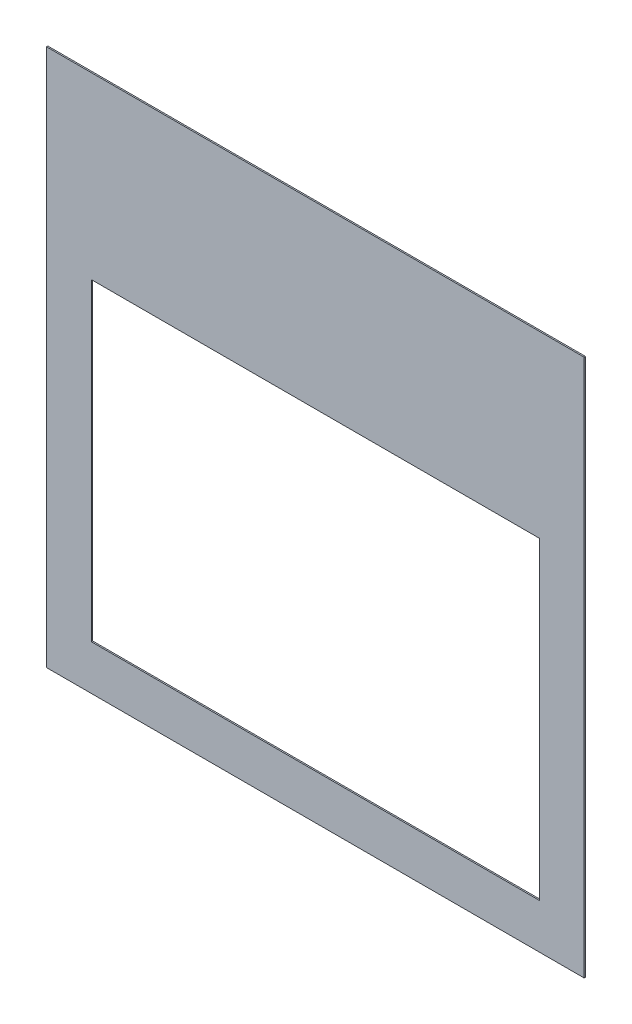
ISO-10303-21;
HEADER;
FILE_DESCRIPTION(('STEP AP214'),'2;1');
FILE_NAME('part.step','',(''),(''),'','','');
FILE_SCHEMA(('AUTOMOTIVE_DESIGN { 1 0 10303 214 1 1 1 1 }'));
ENDSEC;
DATA;
#1=APPLICATION_CONTEXT('core data for automotive mechanical design processes');
#2=APPLICATION_PROTOCOL_DEFINITION('international standard','automotive_design',2000,#1);
#3=PRODUCT_CONTEXT('',#1,'mechanical');
#4=PRODUCT('Part','Part','',(#3));
#5=PRODUCT_RELATED_PRODUCT_CATEGORY('part','',(#4));
#6=PRODUCT_DEFINITION_FORMATION('','',#4);
#7=PRODUCT_DEFINITION_CONTEXT('part definition',#1,'design');
#8=PRODUCT_DEFINITION('design','',#6,#7);
#9=PRODUCT_DEFINITION_SHAPE('','',#8);
#10=(LENGTH_UNIT() NAMED_UNIT(*) SI_UNIT(.MILLI.,.METRE.));
#11=(NAMED_UNIT(*) PLANE_ANGLE_UNIT() SI_UNIT($,.RADIAN.));
#12=(NAMED_UNIT(*) SI_UNIT($,.STERADIAN.) SOLID_ANGLE_UNIT());
#13=UNCERTAINTY_MEASURE_WITH_UNIT(LENGTH_MEASURE(1.E-05),#10,'distance_accuracy_value','');
#14=(GEOMETRIC_REPRESENTATION_CONTEXT(3) GLOBAL_UNCERTAINTY_ASSIGNED_CONTEXT((#13)) GLOBAL_UNIT_ASSIGNED_CONTEXT((#10,
#11,#12)) REPRESENTATION_CONTEXT('',''));
#15=CARTESIAN_POINT('',(0.,0.,0.));
#16=DIRECTION('',(0.,0.,1.));
#17=DIRECTION('',(1.,0.,0.));
#18=AXIS2_PLACEMENT_3D('',#15,#16,#17);
#19=CARTESIAN_POINT('',(-600.,0.,-3.));
#20=DIRECTION('',(-1.,0.,0.));
#21=DIRECTION('',(0.,-1.,0.));
#22=AXIS2_PLACEMENT_3D('',#19,#20,#21);
#23=PLANE('',#22);
#24=DIRECTION('',(0.,-1.,0.));
#25=VECTOR('',#24,1.);
#26=CARTESIAN_POINT('',(-600.,0.,0.));
#27=LINE('',#26,#25);
#28=CARTESIAN_POINT('',(-600.,0.,0.));
#29=VERTEX_POINT('',#28);
#30=CARTESIAN_POINT('',(-600.,-1200.,0.));
#31=VERTEX_POINT('',#30);
#32=EDGE_CURVE('E139',#29,#31,#27,.T.);
#33=ORIENTED_EDGE('',*,*,#32,.F.);
#34=DIRECTION('',(0.,0.,1.));
#35=VECTOR('',#34,1.);
#36=CARTESIAN_POINT('',(-600.,0.,-3.));
#37=LINE('',#36,#35);
#38=CARTESIAN_POINT('',(-600.,0.,-3.));
#39=VERTEX_POINT('',#38);
#40=EDGE_CURVE('E11',#39,#29,#37,.T.);
#41=ORIENTED_EDGE('',*,*,#40,.F.);
#42=DIRECTION('',(0.,-1.,0.));
#43=VECTOR('',#42,1.);
#44=CARTESIAN_POINT('',(-600.,0.,-3.));
#45=LINE('',#44,#43);
#46=CARTESIAN_POINT('',(-600.,-1200.,-3.));
#47=VERTEX_POINT('',#46);
#48=EDGE_CURVE('E143',#39,#47,#45,.T.);
#49=ORIENTED_EDGE('',*,*,#48,.T.);
#50=DIRECTION('',(0.,0.,1.));
#51=VECTOR('',#50,1.);
#52=CARTESIAN_POINT('',(-600.,-1200.,-3.));
#53=LINE('',#52,#51);
#54=EDGE_CURVE('E44',#47,#31,#53,.T.);
#55=ORIENTED_EDGE('',*,*,#54,.T.);
#56=EDGE_LOOP('',(#33,#41,#49,#55));
#57=FACE_BOUND('',#56,.T.);
#58=ADVANCED_FACE('F41',(#57),#23,.T.);
#59=CARTESIAN_POINT('',(-600.,0.,-3.));
#60=DIRECTION('',(0.,1.,0.));
#61=DIRECTION('',(-1.,0.,0.));
#62=AXIS2_PLACEMENT_3D('',#59,#60,#61);
#63=PLANE('',#62);
#64=DIRECTION('',(-1.,0.,0.));
#65=VECTOR('',#64,1.);
#66=CARTESIAN_POINT('',(-600.,0.,0.));
#67=LINE('',#66,#65);
#68=CARTESIAN_POINT('',(600.,2.20436423846524E-13,0.));
#69=VERTEX_POINT('',#68);
#70=EDGE_CURVE('E147',#69,#29,#67,.T.);
#71=ORIENTED_EDGE('',*,*,#70,.F.);
#72=DIRECTION('',(0.,0.,1.));
#73=VECTOR('',#72,1.);
#74=CARTESIAN_POINT('',(600.,2.20436423846524E-13,-3.));
#75=LINE('',#74,#73);
#76=CARTESIAN_POINT('',(600.,2.20436423846524E-13,-3.));
#77=VERTEX_POINT('',#76);
#78=EDGE_CURVE('E49',#77,#69,#75,.T.);
#79=ORIENTED_EDGE('',*,*,#78,.F.);
#80=DIRECTION('',(-1.,0.,0.));
#81=VECTOR('',#80,1.);
#82=CARTESIAN_POINT('',(-600.,0.,-3.));
#83=LINE('',#82,#81);
#84=EDGE_CURVE('E153',#77,#39,#83,.T.);
#85=ORIENTED_EDGE('',*,*,#84,.T.);
#86=ORIENTED_EDGE('',*,*,#40,.T.);
#87=EDGE_LOOP('',(#71,#79,#85,#86));
#88=FACE_BOUND('',#87,.T.);
#89=ADVANCED_FACE('F179',(#88),#63,.T.);
#90=CARTESIAN_POINT('',(600.,2.20436423846524E-13,-3.));
#91=DIRECTION('',(1.,0.,0.));
#92=DIRECTION('',(0.,1.,0.));
#93=AXIS2_PLACEMENT_3D('',#90,#91,#92);
#94=PLANE('',#93);
#95=DIRECTION('',(0.,1.,0.));
#96=VECTOR('',#95,1.);
#97=CARTESIAN_POINT('',(600.,2.20436423846524E-13,0.));
#98=LINE('',#97,#96);
#99=CARTESIAN_POINT('',(600.,-1200.,0.));
#100=VERTEX_POINT('',#99);
#101=EDGE_CURVE('E161',#100,#69,#98,.T.);
#102=ORIENTED_EDGE('',*,*,#101,.F.);
#103=DIRECTION('',(0.,0.,1.));
#104=VECTOR('',#103,1.);
#105=CARTESIAN_POINT('',(600.,-1200.,-3.));
#106=LINE('',#105,#104);
#107=CARTESIAN_POINT('',(600.,-1200.,-3.));
#108=VERTEX_POINT('',#107);
#109=EDGE_CURVE('E166',#108,#100,#106,.T.);
#110=ORIENTED_EDGE('',*,*,#109,.F.);
#111=DIRECTION('',(0.,1.,0.));
#112=VECTOR('',#111,1.);
#113=CARTESIAN_POINT('',(600.,2.20436423846524E-13,-3.));
#114=LINE('',#113,#112);
#115=EDGE_CURVE('E150',#108,#77,#114,.T.);
#116=ORIENTED_EDGE('',*,*,#115,.T.);
#117=ORIENTED_EDGE('',*,*,#78,.T.);
#118=EDGE_LOOP('',(#102,#110,#116,#117));
#119=FACE_BOUND('',#118,.T.);
#120=ADVANCED_FACE('F183',(#119),#94,.T.);
#121=CARTESIAN_POINT('',(-600.,-1200.,-3.));
#122=DIRECTION('',(0.,-1.,0.));
#123=DIRECTION('',(1.,0.,0.));
#124=AXIS2_PLACEMENT_3D('',#121,#122,#123);
#125=PLANE('',#124);
#126=DIRECTION('',(1.,0.,0.));
#127=VECTOR('',#126,1.);
#128=CARTESIAN_POINT('',(-600.,-1200.,0.));
#129=LINE('',#128,#127);
#130=EDGE_CURVE('E158',#31,#100,#129,.T.);
#131=ORIENTED_EDGE('',*,*,#130,.F.);
#132=ORIENTED_EDGE('',*,*,#54,.F.);
#133=DIRECTION('',(1.,0.,0.));
#134=VECTOR('',#133,1.);
#135=CARTESIAN_POINT('',(-600.,-1200.,-3.));
#136=LINE('',#135,#134);
#137=EDGE_CURVE('E146',#47,#108,#136,.T.);
#138=ORIENTED_EDGE('',*,*,#137,.T.);
#139=ORIENTED_EDGE('',*,*,#109,.T.);
#140=EDGE_LOOP('',(#131,#132,#138,#139));
#141=FACE_BOUND('',#140,.T.);
#142=ADVANCED_FACE('F174',(#141),#125,.T.);
#143=CARTESIAN_POINT('',(0.,0.,-3.));
#144=DIRECTION('',(0.,0.,1.));
#145=DIRECTION('',(1.,0.,0.));
#146=AXIS2_PLACEMENT_3D('',#143,#144,#145);
#147=PLANE('',#146);
#148=DIRECTION('',(-1.,0.,0.));
#149=VECTOR('',#148,1.);
#150=CARTESIAN_POINT('',(-500.,-400.,-3.));
#151=LINE('',#150,#149);
#152=CARTESIAN_POINT('',(500.,-400.,-3.));
#153=VERTEX_POINT('',#152);
#154=CARTESIAN_POINT('',(-500.,-400.,-3.));
#155=VERTEX_POINT('',#154);
#156=EDGE_CURVE('E114',#153,#155,#151,.T.);
#157=ORIENTED_EDGE('',*,*,#156,.T.);
#158=DIRECTION('',(0.,-1.,0.));
#159=VECTOR('',#158,1.);
#160=CARTESIAN_POINT('',(-500.,-400.,-3.));
#161=LINE('',#160,#159);
#162=CARTESIAN_POINT('',(-500.,-1100.,-3.));
#163=VERTEX_POINT('',#162);
#164=EDGE_CURVE('E108',#155,#163,#161,.T.);
#165=ORIENTED_EDGE('',*,*,#164,.T.);
#166=DIRECTION('',(1.,0.,0.));
#167=VECTOR('',#166,1.);
#168=CARTESIAN_POINT('',(-500.,-1100.,-3.));
#169=LINE('',#168,#167);
#170=CARTESIAN_POINT('',(500.,-1100.,-3.));
#171=VERTEX_POINT('',#170);
#172=EDGE_CURVE('E117',#163,#171,#169,.T.);
#173=ORIENTED_EDGE('',*,*,#172,.T.);
#174=DIRECTION('',(0.,1.,0.));
#175=VECTOR('',#174,1.);
#176=CARTESIAN_POINT('',(500.,-400.,-3.));
#177=LINE('',#176,#175);
#178=EDGE_CURVE('E57',#171,#153,#177,.T.);
#179=ORIENTED_EDGE('',*,*,#178,.T.);
#180=EDGE_LOOP('',(#157,#165,#173,#179));
#181=FACE_BOUND('',#180,.T.);
#182=ORIENTED_EDGE('',*,*,#48,.F.);
#183=ORIENTED_EDGE('',*,*,#84,.F.);
#184=ORIENTED_EDGE('',*,*,#115,.F.);
#185=ORIENTED_EDGE('',*,*,#137,.F.);
#186=EDGE_LOOP('',(#182,#183,#184,#185));
#187=FACE_BOUND('',#186,.T.);
#188=ADVANCED_FACE('F121',(#181,#187),#147,.F.);
#189=CARTESIAN_POINT('',(0.,0.,0.));
#190=DIRECTION('',(0.,0.,1.));
#191=DIRECTION('',(1.,0.,0.));
#192=AXIS2_PLACEMENT_3D('',#189,#190,#191);
#193=PLANE('',#192);
#194=DIRECTION('',(0.,-1.,0.));
#195=VECTOR('',#194,1.);
#196=CARTESIAN_POINT('',(-500.,-400.,0.));
#197=LINE('',#196,#195);
#198=CARTESIAN_POINT('',(-500.,-400.,0.));
#199=VERTEX_POINT('',#198);
#200=CARTESIAN_POINT('',(-500.,-1100.,0.));
#201=VERTEX_POINT('',#200);
#202=EDGE_CURVE('E65',#199,#201,#197,.T.);
#203=ORIENTED_EDGE('',*,*,#202,.F.);
#204=DIRECTION('',(-1.,0.,0.));
#205=VECTOR('',#204,1.);
#206=CARTESIAN_POINT('',(-500.,-400.,0.));
#207=LINE('',#206,#205);
#208=CARTESIAN_POINT('',(500.,-400.,0.));
#209=VERTEX_POINT('',#208);
#210=EDGE_CURVE('E124',#209,#199,#207,.T.);
#211=ORIENTED_EDGE('',*,*,#210,.F.);
#212=DIRECTION('',(0.,1.,0.));
#213=VECTOR('',#212,1.);
#214=CARTESIAN_POINT('',(500.,-400.,0.));
#215=LINE('',#214,#213);
#216=CARTESIAN_POINT('',(500.,-1100.,0.));
#217=VERTEX_POINT('',#216);
#218=EDGE_CURVE('E127',#217,#209,#215,.T.);
#219=ORIENTED_EDGE('',*,*,#218,.F.);
#220=DIRECTION('',(1.,0.,0.));
#221=VECTOR('',#220,1.);
#222=CARTESIAN_POINT('',(-500.,-1100.,0.));
#223=LINE('',#222,#221);
#224=EDGE_CURVE('E133',#201,#217,#223,.T.);
#225=ORIENTED_EDGE('',*,*,#224,.F.);
#226=EDGE_LOOP('',(#203,#211,#219,#225));
#227=FACE_BOUND('',#226,.T.);
#228=ORIENTED_EDGE('',*,*,#32,.T.);
#229=ORIENTED_EDGE('',*,*,#130,.T.);
#230=ORIENTED_EDGE('',*,*,#101,.T.);
#231=ORIENTED_EDGE('',*,*,#70,.T.);
#232=EDGE_LOOP('',(#228,#229,#230,#231));
#233=FACE_BOUND('',#232,.T.);
#234=ADVANCED_FACE('F176',(#227,#233),#193,.T.);
#235=CARTESIAN_POINT('',(-500.,-400.,-3.));
#236=DIRECTION('',(-1.,0.,0.));
#237=DIRECTION('',(0.,-1.,0.));
#238=AXIS2_PLACEMENT_3D('',#235,#236,#237);
#239=PLANE('',#238);
#240=ORIENTED_EDGE('',*,*,#202,.T.);
#241=DIRECTION('',(0.,0.,1.));
#242=VECTOR('',#241,1.);
#243=CARTESIAN_POINT('',(-500.,-1100.,-3.));
#244=LINE('',#243,#242);
#245=EDGE_CURVE('E104',#163,#201,#244,.T.);
#246=ORIENTED_EDGE('',*,*,#245,.F.);
#247=ORIENTED_EDGE('',*,*,#164,.F.);
#248=DIRECTION('',(0.,0.,1.));
#249=VECTOR('',#248,1.);
#250=CARTESIAN_POINT('',(-500.,-400.,-3.));
#251=LINE('',#250,#249);
#252=EDGE_CURVE('E137',#155,#199,#251,.T.);
#253=ORIENTED_EDGE('',*,*,#252,.T.);
#254=EDGE_LOOP('',(#240,#246,#247,#253));
#255=FACE_BOUND('',#254,.T.);
#256=ADVANCED_FACE('F106',(#255),#239,.F.);
#257=CARTESIAN_POINT('',(-500.,-400.,-3.));
#258=DIRECTION('',(0.,1.,0.));
#259=DIRECTION('',(0.,0.,1.));
#260=AXIS2_PLACEMENT_3D('',#257,#258,#259);
#261=PLANE('',#260);
#262=ORIENTED_EDGE('',*,*,#210,.T.);
#263=ORIENTED_EDGE('',*,*,#252,.F.);
#264=ORIENTED_EDGE('',*,*,#156,.F.);
#265=DIRECTION('',(0.,0.,1.));
#266=VECTOR('',#265,1.);
#267=CARTESIAN_POINT('',(500.,-400.,-3.));
#268=LINE('',#267,#266);
#269=EDGE_CURVE('E140',#153,#209,#268,.T.);
#270=ORIENTED_EDGE('',*,*,#269,.T.);
#271=EDGE_LOOP('',(#262,#263,#264,#270));
#272=FACE_BOUND('',#271,.T.);
#273=ADVANCED_FACE('F239',(#272),#261,.F.);
#274=CARTESIAN_POINT('',(500.,-400.,-3.));
#275=DIRECTION('',(1.,0.,0.));
#276=DIRECTION('',(0.,1.,0.));
#277=AXIS2_PLACEMENT_3D('',#274,#275,#276);
#278=PLANE('',#277);
#279=ORIENTED_EDGE('',*,*,#218,.T.);
#280=ORIENTED_EDGE('',*,*,#269,.F.);
#281=ORIENTED_EDGE('',*,*,#178,.F.);
#282=DIRECTION('',(0.,0.,1.));
#283=VECTOR('',#282,1.);
#284=CARTESIAN_POINT('',(500.,-1100.,-3.));
#285=LINE('',#284,#283);
#286=EDGE_CURVE('E113',#171,#217,#285,.T.);
#287=ORIENTED_EDGE('',*,*,#286,.T.);
#288=EDGE_LOOP('',(#279,#280,#281,#287));
#289=FACE_BOUND('',#288,.T.);
#290=ADVANCED_FACE('F249',(#289),#278,.F.);
#291=CARTESIAN_POINT('',(-500.,-1100.,-3.));
#292=DIRECTION('',(0.,-1.,0.));
#293=DIRECTION('',(0.,0.,-1.));
#294=AXIS2_PLACEMENT_3D('',#291,#292,#293);
#295=PLANE('',#294);
#296=ORIENTED_EDGE('',*,*,#224,.T.);
#297=ORIENTED_EDGE('',*,*,#286,.F.);
#298=ORIENTED_EDGE('',*,*,#172,.F.);
#299=ORIENTED_EDGE('',*,*,#245,.T.);
#300=EDGE_LOOP('',(#296,#297,#298,#299));
#301=FACE_BOUND('',#300,.T.);
#302=ADVANCED_FACE('F118',(#301),#295,.F.);
#303=CLOSED_SHELL('',(#58,#89,#120,#142,#188,#234,#256,#273,#290,#302));
#304=MANIFOLD_SOLID_BREP('B2',#303);
#305=ADVANCED_BREP_SHAPE_REPRESENTATION('',(#18,#304),#14);
#306=SHAPE_DEFINITION_REPRESENTATION(#9,#305);
ENDSEC;
END-ISO-10303-21;
